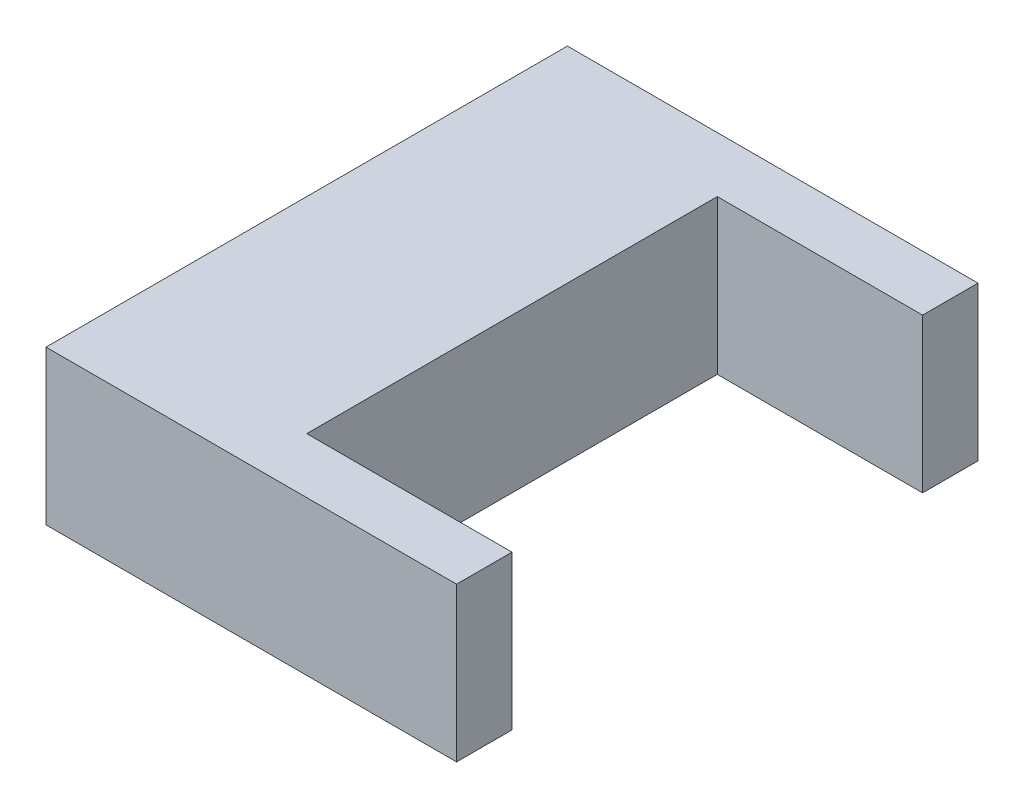
ISO-10303-21;
HEADER;
FILE_DESCRIPTION(('STEP AP214'),'2;1');
FILE_NAME('part.step','',(''),(''),'','','');
FILE_SCHEMA(('AUTOMOTIVE_DESIGN { 1 0 10303 214 1 1 1 1 }'));
ENDSEC;
DATA;
#1=APPLICATION_CONTEXT('core data for automotive mechanical design processes');
#2=APPLICATION_PROTOCOL_DEFINITION('international standard','automotive_design',2000,#1);
#3=PRODUCT_CONTEXT('',#1,'mechanical');
#4=PRODUCT('Part','Part','',(#3));
#5=PRODUCT_RELATED_PRODUCT_CATEGORY('part','',(#4));
#6=PRODUCT_DEFINITION_FORMATION('','',#4);
#7=PRODUCT_DEFINITION_CONTEXT('part definition',#1,'design');
#8=PRODUCT_DEFINITION('design','',#6,#7);
#9=PRODUCT_DEFINITION_SHAPE('','',#8);
#10=(LENGTH_UNIT() NAMED_UNIT(*) SI_UNIT(.MILLI.,.METRE.));
#11=(NAMED_UNIT(*) PLANE_ANGLE_UNIT() SI_UNIT($,.RADIAN.));
#12=(NAMED_UNIT(*) SI_UNIT($,.STERADIAN.) SOLID_ANGLE_UNIT());
#13=UNCERTAINTY_MEASURE_WITH_UNIT(LENGTH_MEASURE(1.E-05),#10,'distance_accuracy_value','');
#14=(GEOMETRIC_REPRESENTATION_CONTEXT(3) GLOBAL_UNCERTAINTY_ASSIGNED_CONTEXT((#13)) GLOBAL_UNIT_ASSIGNED_CONTEXT((#10,
#11,#12)) REPRESENTATION_CONTEXT('',''));
#15=CARTESIAN_POINT('',(0.,0.,0.));
#16=DIRECTION('',(0.,0.,1.));
#17=DIRECTION('',(1.,0.,0.));
#18=AXIS2_PLACEMENT_3D('',#15,#16,#17);
#19=CARTESIAN_POINT('',(0.,15.,-25.4));
#20=DIRECTION('',(0.,0.,1.));
#21=DIRECTION('',(1.,0.,0.));
#22=AXIS2_PLACEMENT_3D('',#19,#20,#21);
#23=PLANE('',#22);
#24=DIRECTION('',(-1.,0.,0.));
#25=VECTOR('',#24,1.);
#26=CARTESIAN_POINT('',(0.,0.,-25.4));
#27=LINE('',#26,#25);
#28=CARTESIAN_POINT('',(40.,0.,-25.4));
#29=VERTEX_POINT('',#28);
#30=CARTESIAN_POINT('',(0.,0.,-25.4));
#31=VERTEX_POINT('',#30);
#32=EDGE_CURVE('E98',#29,#31,#27,.T.);
#33=ORIENTED_EDGE('',*,*,#32,.T.);
#34=DIRECTION('',(0.,-1.,0.));
#35=VECTOR('',#34,1.);
#36=CARTESIAN_POINT('',(0.,15.,-25.4));
#37=LINE('',#36,#35);
#38=CARTESIAN_POINT('',(0.,15.,-25.4));
#39=VERTEX_POINT('',#38);
#40=EDGE_CURVE('E11',#39,#31,#37,.T.);
#41=ORIENTED_EDGE('',*,*,#40,.F.);
#42=DIRECTION('',(-1.,0.,0.));
#43=VECTOR('',#42,1.);
#44=CARTESIAN_POINT('',(40.,15.,-25.4));
#45=LINE('',#44,#43);
#46=CARTESIAN_POINT('',(40.,15.,-25.4));
#47=VERTEX_POINT('',#46);
#48=EDGE_CURVE('E104',#47,#39,#45,.T.);
#49=ORIENTED_EDGE('',*,*,#48,.F.);
#50=DIRECTION('',(0.,-1.,0.));
#51=VECTOR('',#50,1.);
#52=CARTESIAN_POINT('',(40.,15.,-25.4));
#53=LINE('',#52,#51);
#54=EDGE_CURVE('E142',#47,#29,#53,.T.);
#55=ORIENTED_EDGE('',*,*,#54,.T.);
#56=EDGE_LOOP('',(#33,#41,#49,#55));
#57=FACE_BOUND('',#56,.T.);
#58=ADVANCED_FACE('F45',(#57),#23,.F.);
#59=CARTESIAN_POINT('',(0.,15.,25.4));
#60=DIRECTION('',(1.,0.,0.));
#61=DIRECTION('',(0.,0.,-1.));
#62=AXIS2_PLACEMENT_3D('',#59,#60,#61);
#63=PLANE('',#62);
#64=DIRECTION('',(0.,0.,1.));
#65=VECTOR('',#64,1.);
#66=CARTESIAN_POINT('',(0.,0.,25.4));
#67=LINE('',#66,#65);
#68=CARTESIAN_POINT('',(0.,0.,25.4));
#69=VERTEX_POINT('',#68);
#70=EDGE_CURVE('E148',#31,#69,#67,.T.);
#71=ORIENTED_EDGE('',*,*,#70,.T.);
#72=DIRECTION('',(0.,-1.,0.));
#73=VECTOR('',#72,1.);
#74=CARTESIAN_POINT('',(0.,15.,25.4));
#75=LINE('',#74,#73);
#76=CARTESIAN_POINT('',(0.,15.,25.4));
#77=VERTEX_POINT('',#76);
#78=EDGE_CURVE('E54',#77,#69,#75,.T.);
#79=ORIENTED_EDGE('',*,*,#78,.F.);
#80=DIRECTION('',(0.,0.,1.));
#81=VECTOR('',#80,1.);
#82=CARTESIAN_POINT('',(0.,15.,25.4));
#83=LINE('',#82,#81);
#84=EDGE_CURVE('E193',#39,#77,#83,.T.);
#85=ORIENTED_EDGE('',*,*,#84,.F.);
#86=ORIENTED_EDGE('',*,*,#40,.T.);
#87=EDGE_LOOP('',(#71,#79,#85,#86));
#88=FACE_BOUND('',#87,.T.);
#89=ADVANCED_FACE('F192',(#88),#63,.F.);
#90=CARTESIAN_POINT('',(40.,15.,25.4));
#91=DIRECTION('',(0.,0.,-1.));
#92=DIRECTION('',(-1.,0.,0.));
#93=AXIS2_PLACEMENT_3D('',#90,#91,#92);
#94=PLANE('',#93);
#95=DIRECTION('',(1.,0.,0.));
#96=VECTOR('',#95,1.);
#97=CARTESIAN_POINT('',(40.,0.,25.4));
#98=LINE('',#97,#96);
#99=CARTESIAN_POINT('',(40.,0.,25.4));
#100=VERTEX_POINT('',#99);
#101=EDGE_CURVE('E152',#69,#100,#98,.T.);
#102=ORIENTED_EDGE('',*,*,#101,.T.);
#103=DIRECTION('',(0.,-1.,0.));
#104=VECTOR('',#103,1.);
#105=CARTESIAN_POINT('',(40.,15.,25.4));
#106=LINE('',#105,#104);
#107=CARTESIAN_POINT('',(40.,15.,25.4));
#108=VERTEX_POINT('',#107);
#109=EDGE_CURVE('E179',#108,#100,#106,.T.);
#110=ORIENTED_EDGE('',*,*,#109,.F.);
#111=DIRECTION('',(1.,0.,0.));
#112=VECTOR('',#111,1.);
#113=CARTESIAN_POINT('',(0.,15.,25.4));
#114=LINE('',#113,#112);
#115=EDGE_CURVE('E189',#77,#108,#114,.T.);
#116=ORIENTED_EDGE('',*,*,#115,.F.);
#117=ORIENTED_EDGE('',*,*,#78,.T.);
#118=EDGE_LOOP('',(#102,#110,#116,#117));
#119=FACE_BOUND('',#118,.T.);
#120=ADVANCED_FACE('F187',(#119),#94,.F.);
#121=CARTESIAN_POINT('',(40.,15.,20.));
#122=DIRECTION('',(-1.,0.,0.));
#123=DIRECTION('',(0.,0.,1.));
#124=AXIS2_PLACEMENT_3D('',#121,#122,#123);
#125=PLANE('',#124);
#126=DIRECTION('',(0.,0.,-1.));
#127=VECTOR('',#126,1.);
#128=CARTESIAN_POINT('',(40.,0.,20.));
#129=LINE('',#128,#127);
#130=CARTESIAN_POINT('',(40.,0.,20.));
#131=VERTEX_POINT('',#130);
#132=EDGE_CURVE('E155',#100,#131,#129,.T.);
#133=ORIENTED_EDGE('',*,*,#132,.T.);
#134=DIRECTION('',(0.,-1.,0.));
#135=VECTOR('',#134,1.);
#136=CARTESIAN_POINT('',(40.,15.,20.));
#137=LINE('',#136,#135);
#138=CARTESIAN_POINT('',(40.,15.,20.));
#139=VERTEX_POINT('',#138);
#140=EDGE_CURVE('E175',#139,#131,#137,.T.);
#141=ORIENTED_EDGE('',*,*,#140,.F.);
#142=DIRECTION('',(0.,0.,-1.));
#143=VECTOR('',#142,1.);
#144=CARTESIAN_POINT('',(40.,15.,20.));
#145=LINE('',#144,#143);
#146=EDGE_CURVE('E204',#108,#139,#145,.T.);
#147=ORIENTED_EDGE('',*,*,#146,.F.);
#148=ORIENTED_EDGE('',*,*,#109,.T.);
#149=EDGE_LOOP('',(#133,#141,#147,#148));
#150=FACE_BOUND('',#149,.T.);
#151=ADVANCED_FACE('F199',(#150),#125,.F.);
#152=CARTESIAN_POINT('',(40.,15.,20.));
#153=DIRECTION('',(0.,0.,1.));
#154=DIRECTION('',(1.,0.,0.));
#155=AXIS2_PLACEMENT_3D('',#152,#153,#154);
#156=PLANE('',#155);
#157=DIRECTION('',(-1.,0.,0.));
#158=VECTOR('',#157,1.);
#159=CARTESIAN_POINT('',(40.,0.,20.));
#160=LINE('',#159,#158);
#161=CARTESIAN_POINT('',(20.,0.,20.));
#162=VERTEX_POINT('',#161);
#163=EDGE_CURVE('E158',#131,#162,#160,.T.);
#164=ORIENTED_EDGE('',*,*,#163,.T.);
#165=DIRECTION('',(0.,-1.,0.));
#166=VECTOR('',#165,1.);
#167=CARTESIAN_POINT('',(20.,15.,20.));
#168=LINE('',#167,#166);
#169=CARTESIAN_POINT('',(20.,15.,20.));
#170=VERTEX_POINT('',#169);
#171=EDGE_CURVE('E135',#170,#162,#168,.T.);
#172=ORIENTED_EDGE('',*,*,#171,.F.);
#173=DIRECTION('',(-1.,0.,0.));
#174=VECTOR('',#173,1.);
#175=CARTESIAN_POINT('',(40.,15.,20.));
#176=LINE('',#175,#174);
#177=EDGE_CURVE('E124',#139,#170,#176,.T.);
#178=ORIENTED_EDGE('',*,*,#177,.F.);
#179=ORIENTED_EDGE('',*,*,#140,.T.);
#180=EDGE_LOOP('',(#164,#172,#178,#179));
#181=FACE_BOUND('',#180,.T.);
#182=ADVANCED_FACE('F202',(#181),#156,.F.);
#183=CARTESIAN_POINT('',(20.,15.,20.));
#184=DIRECTION('',(-1.,0.,0.));
#185=DIRECTION('',(0.,0.,1.));
#186=AXIS2_PLACEMENT_3D('',#183,#184,#185);
#187=PLANE('',#186);
#188=DIRECTION('',(0.,0.,-1.));
#189=VECTOR('',#188,1.);
#190=CARTESIAN_POINT('',(20.,0.,20.));
#191=LINE('',#190,#189);
#192=CARTESIAN_POINT('',(20.,0.,-20.));
#193=VERTEX_POINT('',#192);
#194=EDGE_CURVE('E133',#162,#193,#191,.T.);
#195=ORIENTED_EDGE('',*,*,#194,.T.);
#196=DIRECTION('',(0.,-1.,0.));
#197=VECTOR('',#196,1.);
#198=CARTESIAN_POINT('',(20.,15.,-20.));
#199=LINE('',#198,#197);
#200=CARTESIAN_POINT('',(20.,15.,-20.));
#201=VERTEX_POINT('',#200);
#202=EDGE_CURVE('E130',#201,#193,#199,.T.);
#203=ORIENTED_EDGE('',*,*,#202,.F.);
#204=DIRECTION('',(0.,0.,-1.));
#205=VECTOR('',#204,1.);
#206=CARTESIAN_POINT('',(20.,15.,20.));
#207=LINE('',#206,#205);
#208=EDGE_CURVE('E118',#170,#201,#207,.T.);
#209=ORIENTED_EDGE('',*,*,#208,.F.);
#210=ORIENTED_EDGE('',*,*,#171,.T.);
#211=EDGE_LOOP('',(#195,#203,#209,#210));
#212=FACE_BOUND('',#211,.T.);
#213=ADVANCED_FACE('F131',(#212),#187,.F.);
#214=CARTESIAN_POINT('',(40.,15.,-20.));
#215=DIRECTION('',(0.,0.,-1.));
#216=DIRECTION('',(-1.,0.,0.));
#217=AXIS2_PLACEMENT_3D('',#214,#215,#216);
#218=PLANE('',#217);
#219=DIRECTION('',(1.,0.,0.));
#220=VECTOR('',#219,1.);
#221=CARTESIAN_POINT('',(40.,0.,-20.));
#222=LINE('',#221,#220);
#223=CARTESIAN_POINT('',(40.,0.,-20.));
#224=VERTEX_POINT('',#223);
#225=EDGE_CURVE('E91',#193,#224,#222,.T.);
#226=ORIENTED_EDGE('',*,*,#225,.T.);
#227=DIRECTION('',(0.,-1.,0.));
#228=VECTOR('',#227,1.);
#229=CARTESIAN_POINT('',(40.,15.,-20.));
#230=LINE('',#229,#228);
#231=CARTESIAN_POINT('',(40.,15.,-20.));
#232=VERTEX_POINT('',#231);
#233=EDGE_CURVE('E136',#232,#224,#230,.T.);
#234=ORIENTED_EDGE('',*,*,#233,.F.);
#235=DIRECTION('',(1.,0.,0.));
#236=VECTOR('',#235,1.);
#237=CARTESIAN_POINT('',(40.,15.,-20.));
#238=LINE('',#237,#236);
#239=EDGE_CURVE('E122',#201,#232,#238,.T.);
#240=ORIENTED_EDGE('',*,*,#239,.F.);
#241=ORIENTED_EDGE('',*,*,#202,.T.);
#242=EDGE_LOOP('',(#226,#234,#240,#241));
#243=FACE_BOUND('',#242,.T.);
#244=ADVANCED_FACE('F138',(#243),#218,.F.);
#245=CARTESIAN_POINT('',(40.,15.,-20.));
#246=DIRECTION('',(-1.,0.,0.));
#247=DIRECTION('',(0.,0.,1.));
#248=AXIS2_PLACEMENT_3D('',#245,#246,#247);
#249=PLANE('',#248);
#250=DIRECTION('',(0.,0.,-1.));
#251=VECTOR('',#250,1.);
#252=CARTESIAN_POINT('',(40.,0.,-20.));
#253=LINE('',#252,#251);
#254=EDGE_CURVE('E165',#224,#29,#253,.T.);
#255=ORIENTED_EDGE('',*,*,#254,.T.);
#256=ORIENTED_EDGE('',*,*,#54,.F.);
#257=DIRECTION('',(0.,0.,-1.));
#258=VECTOR('',#257,1.);
#259=CARTESIAN_POINT('',(40.,15.,-20.));
#260=LINE('',#259,#258);
#261=EDGE_CURVE('E62',#232,#47,#260,.T.);
#262=ORIENTED_EDGE('',*,*,#261,.F.);
#263=ORIENTED_EDGE('',*,*,#233,.T.);
#264=EDGE_LOOP('',(#255,#256,#262,#263));
#265=FACE_BOUND('',#264,.T.);
#266=ADVANCED_FACE('F214',(#265),#249,.F.);
#267=CARTESIAN_POINT('',(0.,15.,0.));
#268=DIRECTION('',(0.,-1.,0.));
#269=DIRECTION('',(0.,0.,-1.));
#270=AXIS2_PLACEMENT_3D('',#267,#268,#269);
#271=PLANE('',#270);
#272=ORIENTED_EDGE('',*,*,#48,.T.);
#273=ORIENTED_EDGE('',*,*,#84,.T.);
#274=ORIENTED_EDGE('',*,*,#115,.T.);
#275=ORIENTED_EDGE('',*,*,#146,.T.);
#276=ORIENTED_EDGE('',*,*,#177,.T.);
#277=ORIENTED_EDGE('',*,*,#208,.T.);
#278=ORIENTED_EDGE('',*,*,#239,.T.);
#279=ORIENTED_EDGE('',*,*,#261,.T.);
#280=EDGE_LOOP('',(#272,#273,#274,#275,#276,#277,#278,#279));
#281=FACE_BOUND('',#280,.T.);
#282=ADVANCED_FACE('F120',(#281),#271,.F.);
#283=CARTESIAN_POINT('',(0.,0.,0.));
#284=DIRECTION('',(0.,-1.,0.));
#285=DIRECTION('',(0.,0.,-1.));
#286=AXIS2_PLACEMENT_3D('',#283,#284,#285);
#287=PLANE('',#286);
#288=ORIENTED_EDGE('',*,*,#32,.F.);
#289=ORIENTED_EDGE('',*,*,#254,.F.);
#290=ORIENTED_EDGE('',*,*,#225,.F.);
#291=ORIENTED_EDGE('',*,*,#194,.F.);
#292=ORIENTED_EDGE('',*,*,#163,.F.);
#293=ORIENTED_EDGE('',*,*,#132,.F.);
#294=ORIENTED_EDGE('',*,*,#101,.F.);
#295=ORIENTED_EDGE('',*,*,#70,.F.);
#296=EDGE_LOOP('',(#288,#289,#290,#291,#292,#293,#294,#295));
#297=FACE_BOUND('',#296,.T.);
#298=ADVANCED_FACE('F194',(#297),#287,.T.);
#299=CLOSED_SHELL('',(#58,#89,#120,#151,#182,#213,#244,#266,#282,#298));
#300=MANIFOLD_SOLID_BREP('B2',#299);
#301=ADVANCED_BREP_SHAPE_REPRESENTATION('',(#18,#300),#14);
#302=SHAPE_DEFINITION_REPRESENTATION(#9,#301);
ENDSEC;
END-ISO-10303-21;
